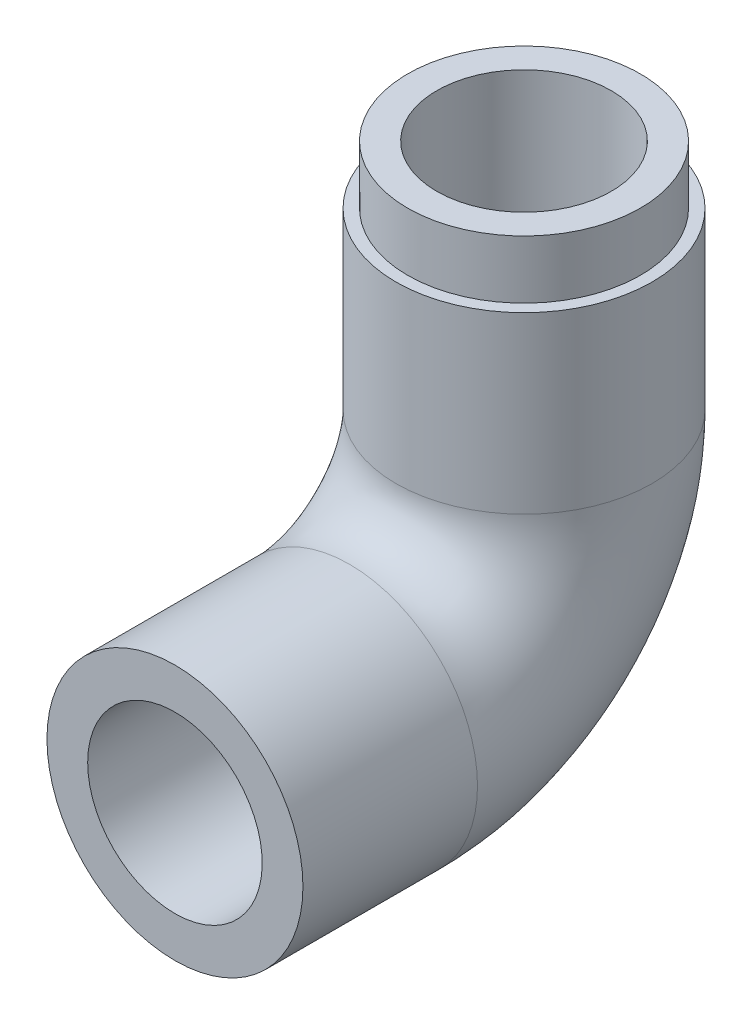
ISO-10303-21;
HEADER;
FILE_DESCRIPTION(('STEP AP214'),'2;1');
FILE_NAME('part.step','',(''),(''),'','','');
FILE_SCHEMA(('AUTOMOTIVE_DESIGN { 1 0 10303 214 1 1 1 1 }'));
ENDSEC;
DATA;
#1=APPLICATION_CONTEXT('core data for automotive mechanical design processes');
#2=APPLICATION_PROTOCOL_DEFINITION('international standard','automotive_design',2000,#1);
#3=PRODUCT_CONTEXT('',#1,'mechanical');
#4=PRODUCT('Part','Part','',(#3));
#5=PRODUCT_RELATED_PRODUCT_CATEGORY('part','',(#4));
#6=PRODUCT_DEFINITION_FORMATION('','',#4);
#7=PRODUCT_DEFINITION_CONTEXT('part definition',#1,'design');
#8=PRODUCT_DEFINITION('design','',#6,#7);
#9=PRODUCT_DEFINITION_SHAPE('','',#8);
#10=(LENGTH_UNIT() NAMED_UNIT(*) SI_UNIT(.MILLI.,.METRE.));
#11=(NAMED_UNIT(*) PLANE_ANGLE_UNIT() SI_UNIT($,.RADIAN.));
#12=(NAMED_UNIT(*) SI_UNIT($,.STERADIAN.) SOLID_ANGLE_UNIT());
#13=UNCERTAINTY_MEASURE_WITH_UNIT(LENGTH_MEASURE(1.E-05),#10,'distance_accuracy_value','');
#14=(GEOMETRIC_REPRESENTATION_CONTEXT(3) GLOBAL_UNCERTAINTY_ASSIGNED_CONTEXT((#13)) GLOBAL_UNIT_ASSIGNED_CONTEXT((#10,
#11,#12)) REPRESENTATION_CONTEXT('',''));
#15=CARTESIAN_POINT('',(0.,0.,0.));
#16=DIRECTION('',(0.,0.,1.));
#17=DIRECTION('',(1.,0.,0.));
#18=AXIS2_PLACEMENT_3D('',#15,#16,#17);
#19=CARTESIAN_POINT('',(0.,0.,0.));
#20=DIRECTION('',(0.,1.,0.));
#21=DIRECTION('',(-1.,0.,0.));
#22=AXIS2_PLACEMENT_3D('',#19,#20,#21);
#23=PLANE('',#22);
#24=CARTESIAN_POINT('',(0.,0.,0.));
#25=DIRECTION('',(0.,1.,0.));
#26=DIRECTION('',(0.,0.,1.));
#27=AXIS2_PLACEMENT_3D('',#24,#25,#26);
#28=CIRCLE('',#27,10.);
#29=CARTESIAN_POINT('',(0.,0.,9.99999999999999));
#30=VERTEX_POINT('',#29);
#31=EDGE_CURVE('E11',#30,#30,#28,.T.);
#32=ORIENTED_EDGE('',*,*,#31,.F.);
#33=EDGE_LOOP('',(#32));
#34=FACE_BOUND('',#33,.T.);
#35=CARTESIAN_POINT('',(0.,0.,0.));
#36=DIRECTION('',(0.,1.,0.));
#37=DIRECTION('',(-1.,0.,0.));
#38=AXIS2_PLACEMENT_3D('',#35,#36,#37);
#39=CIRCLE('',#38,11.);
#40=CARTESIAN_POINT('',(-11.,0.,0.));
#41=VERTEX_POINT('',#40);
#42=EDGE_CURVE('E76',#41,#41,#39,.T.);
#43=ORIENTED_EDGE('',*,*,#42,.T.);
#44=EDGE_LOOP('',(#43));
#45=FACE_BOUND('',#44,.T.);
#46=ADVANCED_FACE('F57',(#34,#45),#23,.T.);
#47=CARTESIAN_POINT('',(0.,-30.,30.));
#48=DIRECTION('',(0.,0.,-1.));
#49=DIRECTION('',(-1.,0.,0.));
#50=AXIS2_PLACEMENT_3D('',#47,#48,#49);
#51=PLANE('',#50);
#52=CARTESIAN_POINT('',(0.,-30.,30.));
#53=DIRECTION('',(0.,0.,-1.));
#54=DIRECTION('',(-1.,0.,0.));
#55=AXIS2_PLACEMENT_3D('',#52,#53,#54);
#56=CIRCLE('',#55,7.5);
#57=CARTESIAN_POINT('',(-7.5,-30.,30.));
#58=VERTEX_POINT('',#57);
#59=EDGE_CURVE('E73',#58,#58,#56,.T.);
#60=ORIENTED_EDGE('',*,*,#59,.T.);
#61=EDGE_LOOP('',(#60));
#62=FACE_BOUND('',#61,.T.);
#63=CARTESIAN_POINT('',(0.,-30.,30.));
#64=DIRECTION('',(0.,0.,-1.));
#65=DIRECTION('',(-1.,0.,0.));
#66=AXIS2_PLACEMENT_3D('',#63,#64,#65);
#67=CIRCLE('',#66,11.);
#68=CARTESIAN_POINT('',(0.,-41.,30.));
#69=VERTEX_POINT('',#68);
#70=EDGE_CURVE('E60',#69,#69,#67,.T.);
#71=ORIENTED_EDGE('',*,*,#70,.F.);
#72=EDGE_LOOP('',(#71));
#73=FACE_BOUND('',#72,.T.);
#74=ADVANCED_FACE('F109',(#62,#73),#51,.F.);
#75=CARTESIAN_POINT('',(0.,0.,0.));
#76=DIRECTION('',(0.,-1.,0.));
#77=DIRECTION('',(0.,0.,-1.));
#78=AXIS2_PLACEMENT_3D('',#75,#76,#77);
#79=CYLINDRICAL_SURFACE('',#78,11.);
#80=CARTESIAN_POINT('',(0.,-15.,0.));
#81=DIRECTION('',(0.,1.,0.));
#82=DIRECTION('',(-1.,0.,0.));
#83=AXIS2_PLACEMENT_3D('',#80,#81,#82);
#84=CIRCLE('',#83,11.);
#85=CARTESIAN_POINT('',(0.,-15.,-11.));
#86=VERTEX_POINT('',#85);
#87=EDGE_CURVE('E85',#86,#86,#84,.T.);
#88=ORIENTED_EDGE('',*,*,#87,.T.);
#89=EDGE_LOOP('',(#88));
#90=FACE_BOUND('',#89,.T.);
#91=ORIENTED_EDGE('',*,*,#42,.F.);
#92=EDGE_LOOP('',(#91));
#93=FACE_BOUND('',#92,.T.);
#94=ADVANCED_FACE('F106',(#90,#93),#79,.T.);
#95=CARTESIAN_POINT('',(0.,-15.,15.));
#96=DIRECTION('',(-1.,0.,0.));
#97=DIRECTION('',(0.,0.,1.));
#98=AXIS2_PLACEMENT_3D('',#95,#96,#97);
#99=TOROIDAL_SURFACE('',#98,15.,11.);
#100=CARTESIAN_POINT('',(0.,-30.,15.));
#101=DIRECTION('',(0.,0.,-1.));
#102=DIRECTION('',(-1.,0.,0.));
#103=AXIS2_PLACEMENT_3D('',#100,#101,#102);
#104=CIRCLE('',#103,11.);
#105=CARTESIAN_POINT('',(0.,-41.,15.));
#106=VERTEX_POINT('',#105);
#107=EDGE_CURVE('E68',#106,#106,#104,.T.);
#108=CARTESIAN_POINT('',(0.,-15.,15.));
#109=DIRECTION('',(-1.,0.,0.));
#110=DIRECTION('',(0.,0.,1.));
#111=AXIS2_PLACEMENT_3D('',#108,#109,#110);
#112=CIRCLE('',#111,26.);
#113=EDGE_CURVE('',#86,#106,#112,.T.);
#114=ORIENTED_EDGE('',*,*,#87,.F.);
#115=ORIENTED_EDGE('',*,*,#107,.T.);
#116=ORIENTED_EDGE('',*,*,#113,.T.);
#117=ORIENTED_EDGE('',*,*,#113,.F.);
#118=EDGE_LOOP('',(#114,#116,#115,#117));
#119=FACE_BOUND('',#118,.T.);
#120=ADVANCED_FACE('F90',(#119),#99,.T.);
#121=CARTESIAN_POINT('',(0.,-30.,15.));
#122=DIRECTION('',(0.,0.,1.));
#123=DIRECTION('',(0.,-1.,0.));
#124=AXIS2_PLACEMENT_3D('',#121,#122,#123);
#125=CYLINDRICAL_SURFACE('',#124,11.);
#126=CARTESIAN_POINT('',(0.,-41.,30.));
#127=CARTESIAN_POINT('',(0.,-41.,29.84375));
#128=CARTESIAN_POINT('',(0.,-41.,29.6875));
#129=CARTESIAN_POINT('',(0.,-41.,29.375));
#130=CARTESIAN_POINT('',(0.,-41.,29.21875));
#131=CARTESIAN_POINT('',(0.,-41.,28.90625));
#132=CARTESIAN_POINT('',(0.,-41.,28.75));
#133=CARTESIAN_POINT('',(0.,-41.,28.4375));
#134=CARTESIAN_POINT('',(0.,-41.,28.28125));
#135=CARTESIAN_POINT('',(0.,-41.,27.96875));
#136=CARTESIAN_POINT('',(0.,-41.,27.8125));
#137=CARTESIAN_POINT('',(0.,-41.,27.5));
#138=CARTESIAN_POINT('',(0.,-41.,27.34375));
#139=CARTESIAN_POINT('',(0.,-41.,27.03125));
#140=CARTESIAN_POINT('',(0.,-41.,26.875));
#141=CARTESIAN_POINT('',(0.,-41.,26.5625));
#142=CARTESIAN_POINT('',(0.,-41.,26.40625));
#143=CARTESIAN_POINT('',(0.,-41.,26.09375));
#144=CARTESIAN_POINT('',(0.,-41.,25.9375));
#145=CARTESIAN_POINT('',(0.,-41.,25.625));
#146=CARTESIAN_POINT('',(0.,-41.,25.46875));
#147=CARTESIAN_POINT('',(0.,-41.,25.15625));
#148=CARTESIAN_POINT('',(0.,-41.,25.));
#149=CARTESIAN_POINT('',(0.,-41.,24.6875));
#150=CARTESIAN_POINT('',(0.,-41.,24.53125));
#151=CARTESIAN_POINT('',(0.,-41.,24.21875));
#152=CARTESIAN_POINT('',(0.,-41.,24.0625));
#153=CARTESIAN_POINT('',(0.,-41.,23.75));
#154=CARTESIAN_POINT('',(0.,-41.,23.59375));
#155=CARTESIAN_POINT('',(0.,-41.,23.28125));
#156=CARTESIAN_POINT('',(0.,-41.,23.125));
#157=CARTESIAN_POINT('',(0.,-41.,22.8125));
#158=CARTESIAN_POINT('',(0.,-41.,22.65625));
#159=CARTESIAN_POINT('',(0.,-41.,22.34375));
#160=CARTESIAN_POINT('',(0.,-41.,22.1875));
#161=CARTESIAN_POINT('',(0.,-41.,21.875));
#162=CARTESIAN_POINT('',(0.,-41.,21.71875));
#163=CARTESIAN_POINT('',(0.,-41.,21.40625));
#164=CARTESIAN_POINT('',(0.,-41.,21.25));
#165=CARTESIAN_POINT('',(0.,-41.,20.9375));
#166=CARTESIAN_POINT('',(0.,-41.,20.78125));
#167=CARTESIAN_POINT('',(0.,-41.,20.46875));
#168=CARTESIAN_POINT('',(0.,-41.,20.3125));
#169=CARTESIAN_POINT('',(0.,-41.,20.));
#170=CARTESIAN_POINT('',(0.,-41.,19.84375));
#171=CARTESIAN_POINT('',(0.,-41.,19.53125));
#172=CARTESIAN_POINT('',(0.,-41.,19.375));
#173=CARTESIAN_POINT('',(0.,-41.,19.0625));
#174=CARTESIAN_POINT('',(0.,-41.,18.90625));
#175=CARTESIAN_POINT('',(0.,-41.,18.59375));
#176=CARTESIAN_POINT('',(0.,-41.,18.4375));
#177=CARTESIAN_POINT('',(0.,-41.,18.125));
#178=CARTESIAN_POINT('',(0.,-41.,17.96875));
#179=CARTESIAN_POINT('',(0.,-41.,17.65625));
#180=CARTESIAN_POINT('',(0.,-41.,17.5));
#181=CARTESIAN_POINT('',(0.,-41.,17.1875));
#182=CARTESIAN_POINT('',(0.,-41.,17.03125));
#183=CARTESIAN_POINT('',(0.,-41.,16.71875));
#184=CARTESIAN_POINT('',(0.,-41.,16.5625));
#185=CARTESIAN_POINT('',(0.,-41.,16.25));
#186=CARTESIAN_POINT('',(0.,-41.,16.09375));
#187=CARTESIAN_POINT('',(0.,-41.,15.78125));
#188=CARTESIAN_POINT('',(0.,-41.,15.625));
#189=CARTESIAN_POINT('',(0.,-41.,15.3125));
#190=CARTESIAN_POINT('',(0.,-41.,15.15625));
#191=CARTESIAN_POINT('',(0.,-41.,15.));
#192=B_SPLINE_CURVE_WITH_KNOTS('',3,(#126,#127,#128,#129,#130,#131,#132,#133,#134,#135,#136,
#137,#138,#139,#140,#141,#142,#143,#144,#145,#146,#147,#148,#149,#150,#151,#152,#153,#154,#155,
#156,#157,#158,#159,#160,#161,#162,#163,#164,#165,#166,#167,#168,#169,#170,#171,#172,#173,#174,
#175,#176,#177,#178,#179,#180,#181,#182,#183,#184,#185,#186,#187,#188,#189,#190,#191),
.UNSPECIFIED.,.F.,.F.,(4,2,2,2,2,2,2,2,2,2,2,2,2,2,2,2,2,2,2,2,2,2,2,2,2,2,2,2,2,2,2,2,4),(0.,
0.468750000000004,0.937500000000001,1.40625,1.875,2.34375,2.8125,3.28125,3.75,4.21875,4.6875,
5.15625,5.625,6.09375,6.5625,7.03125,7.5,7.96875,8.4375,8.90625,9.375,9.84375,10.3125,10.78125,
11.25,11.71875,12.1875,12.65625,13.125,13.59375,14.0625,14.53125,15.),.UNSPECIFIED.);
#193=EDGE_CURVE('BSEAM93',#69,#106,#192,.T.);
#194=ORIENTED_EDGE('',*,*,#70,.T.);
#195=ORIENTED_EDGE('',*,*,#107,.F.);
#196=ORIENTED_EDGE('',*,*,#193,.T.);
#197=ORIENTED_EDGE('',*,*,#193,.F.);
#198=EDGE_LOOP('',(#194,#196,#195,#197));
#199=FACE_BOUND('',#198,.T.);
#200=ADVANCED_FACE('F93',(#199),#125,.T.);
#201=CARTESIAN_POINT('',(0.,1.,0.));
#202=DIRECTION('',(0.,-1.,0.));
#203=DIRECTION('',(0.,0.,-1.));
#204=AXIS2_PLACEMENT_3D('',#201,#202,#203);
#205=CYLINDRICAL_SURFACE('',#204,7.5);
#206=CARTESIAN_POINT('',(0.,-15.,0.));
#207=DIRECTION('',(0.,1.,0.));
#208=DIRECTION('',(-1.,0.,0.));
#209=AXIS2_PLACEMENT_3D('',#206,#207,#208);
#210=CIRCLE('',#209,7.5);
#211=CARTESIAN_POINT('',(0.,-15.,-7.5));
#212=VERTEX_POINT('',#211);
#213=EDGE_CURVE('E80',#212,#212,#210,.T.);
#214=ORIENTED_EDGE('',*,*,#213,.F.);
#215=EDGE_LOOP('',(#214));
#216=FACE_BOUND('',#215,.T.);
#217=CARTESIAN_POINT('',(0.,5.,0.));
#218=DIRECTION('',(0.,1.,0.));
#219=DIRECTION('',(0.,0.,1.));
#220=AXIS2_PLACEMENT_3D('',#217,#218,#219);
#221=CIRCLE('',#220,7.49999999999999);
#222=CARTESIAN_POINT('',(0.,5.,7.49999999999998));
#223=VERTEX_POINT('',#222);
#224=EDGE_CURVE('E135',#223,#223,#221,.T.);
#225=ORIENTED_EDGE('',*,*,#224,.T.);
#226=EDGE_LOOP('',(#225));
#227=FACE_BOUND('',#226,.T.);
#228=ADVANCED_FACE('F95',(#216,#227),#205,.F.);
#229=CARTESIAN_POINT('',(0.,-15.,15.));
#230=DIRECTION('',(-1.,0.,0.));
#231=DIRECTION('',(0.,0.,1.));
#232=AXIS2_PLACEMENT_3D('',#229,#230,#231);
#233=TOROIDAL_SURFACE('',#232,15.,7.5);
#234=CARTESIAN_POINT('',(0.,-30.,15.));
#235=DIRECTION('',(0.,0.,-1.));
#236=DIRECTION('',(-1.,0.,0.));
#237=AXIS2_PLACEMENT_3D('',#234,#235,#236);
#238=CIRCLE('',#237,7.5);
#239=CARTESIAN_POINT('',(0.,-37.5,15.));
#240=VERTEX_POINT('',#239);
#241=EDGE_CURVE('E77',#240,#240,#238,.T.);
#242=CARTESIAN_POINT('',(0.,-15.,15.));
#243=DIRECTION('',(-1.,0.,0.));
#244=DIRECTION('',(0.,0.,1.));
#245=AXIS2_PLACEMENT_3D('',#242,#243,#244);
#246=CIRCLE('',#245,22.5);
#247=EDGE_CURVE('',#212,#240,#246,.T.);
#248=ORIENTED_EDGE('',*,*,#213,.T.);
#249=ORIENTED_EDGE('',*,*,#241,.F.);
#250=ORIENTED_EDGE('',*,*,#247,.T.);
#251=ORIENTED_EDGE('',*,*,#247,.F.);
#252=EDGE_LOOP('',(#248,#250,#249,#251));
#253=FACE_BOUND('',#252,.T.);
#254=ADVANCED_FACE('F102',(#253),#233,.F.);
#255=CARTESIAN_POINT('',(0.,-30.,15.));
#256=DIRECTION('',(0.,0.,1.));
#257=DIRECTION('',(0.,-1.,0.));
#258=AXIS2_PLACEMENT_3D('',#255,#256,#257);
#259=CYLINDRICAL_SURFACE('',#258,7.5);
#260=ORIENTED_EDGE('',*,*,#59,.F.);
#261=EDGE_LOOP('',(#260));
#262=FACE_BOUND('',#261,.T.);
#263=ORIENTED_EDGE('',*,*,#241,.T.);
#264=EDGE_LOOP('',(#263));
#265=FACE_BOUND('',#264,.T.);
#266=ADVANCED_FACE('F105',(#262,#265),#259,.F.);
#267=CARTESIAN_POINT('',(0.,5.,0.));
#268=DIRECTION('',(0.,1.,0.));
#269=DIRECTION('',(0.,0.,1.));
#270=AXIS2_PLACEMENT_3D('',#267,#268,#269);
#271=PLANE('',#270);
#272=CARTESIAN_POINT('',(0.,5.,0.));
#273=DIRECTION('',(0.,1.,0.));
#274=DIRECTION('',(0.,0.,1.));
#275=AXIS2_PLACEMENT_3D('',#272,#273,#274);
#276=CIRCLE('',#275,10.);
#277=CARTESIAN_POINT('',(0.,5.,9.99999999999999));
#278=VERTEX_POINT('',#277);
#279=EDGE_CURVE('E71',#278,#278,#276,.T.);
#280=ORIENTED_EDGE('',*,*,#279,.T.);
#281=EDGE_LOOP('',(#280));
#282=FACE_BOUND('',#281,.T.);
#283=ORIENTED_EDGE('',*,*,#224,.F.);
#284=EDGE_LOOP('',(#283));
#285=FACE_BOUND('',#284,.T.);
#286=ADVANCED_FACE('F124',(#282,#285),#271,.T.);
#287=CARTESIAN_POINT('',(0.,5.,0.));
#288=DIRECTION('',(0.,-1.,0.));
#289=DIRECTION('',(0.,0.,-1.));
#290=AXIS2_PLACEMENT_3D('',#287,#288,#289);
#291=CYLINDRICAL_SURFACE('',#290,10.);
#292=ORIENTED_EDGE('',*,*,#279,.F.);
#293=EDGE_LOOP('',(#292));
#294=FACE_BOUND('',#293,.T.);
#295=ORIENTED_EDGE('',*,*,#31,.T.);
#296=EDGE_LOOP('',(#295));
#297=FACE_BOUND('',#296,.T.);
#298=ADVANCED_FACE('F141',(#294,#297),#291,.T.);
#299=CLOSED_SHELL('',(#46,#74,#94,#120,#200,#228,#254,#266,#286,#298));
#300=MANIFOLD_SOLID_BREP('B2',#299);
#301=ADVANCED_BREP_SHAPE_REPRESENTATION('',(#18,#300),#14);
#302=SHAPE_DEFINITION_REPRESENTATION(#9,#301);
ENDSEC;
END-ISO-10303-21;
